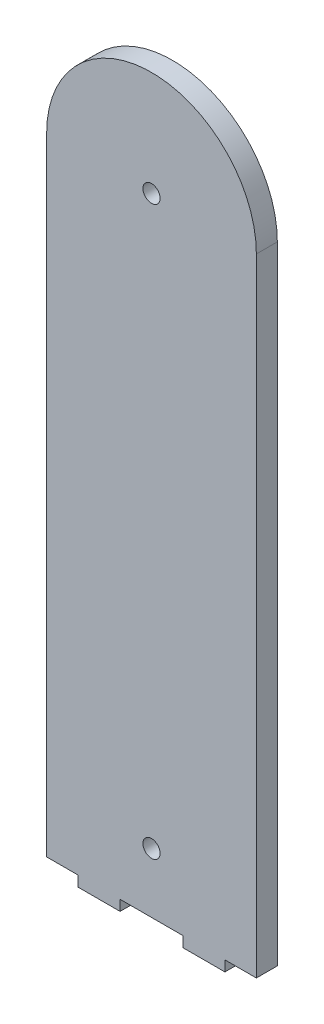
ISO-10303-21;
HEADER;
FILE_DESCRIPTION(('STEP AP214'),'2;1');
FILE_NAME('part.step','',(''),(''),'','','');
FILE_SCHEMA(('AUTOMOTIVE_DESIGN { 1 0 10303 214 1 1 1 1 }'));
ENDSEC;
DATA;
#1=APPLICATION_CONTEXT('core data for automotive mechanical design processes');
#2=APPLICATION_PROTOCOL_DEFINITION('international standard','automotive_design',2000,#1);
#3=PRODUCT_CONTEXT('',#1,'mechanical');
#4=PRODUCT('Part','Part','',(#3));
#5=PRODUCT_RELATED_PRODUCT_CATEGORY('part','',(#4));
#6=PRODUCT_DEFINITION_FORMATION('','',#4);
#7=PRODUCT_DEFINITION_CONTEXT('part definition',#1,'design');
#8=PRODUCT_DEFINITION('design','',#6,#7);
#9=PRODUCT_DEFINITION_SHAPE('','',#8);
#10=(LENGTH_UNIT() NAMED_UNIT(*) SI_UNIT(.MILLI.,.METRE.));
#11=(NAMED_UNIT(*) PLANE_ANGLE_UNIT() SI_UNIT($,.RADIAN.));
#12=(NAMED_UNIT(*) SI_UNIT($,.STERADIAN.) SOLID_ANGLE_UNIT());
#13=UNCERTAINTY_MEASURE_WITH_UNIT(LENGTH_MEASURE(1.E-05),#10,'distance_accuracy_value','');
#14=(GEOMETRIC_REPRESENTATION_CONTEXT(3) GLOBAL_UNCERTAINTY_ASSIGNED_CONTEXT((#13)) GLOBAL_UNIT_ASSIGNED_CONTEXT((#10,
#11,#12)) REPRESENTATION_CONTEXT('',''));
#15=CARTESIAN_POINT('',(0.,0.,0.));
#16=DIRECTION('',(0.,0.,1.));
#17=DIRECTION('',(1.,0.,0.));
#18=AXIS2_PLACEMENT_3D('',#15,#16,#17);
#19=CARTESIAN_POINT('',(-50.,0.,-10.));
#20=DIRECTION('',(-1.,0.,0.));
#21=DIRECTION('',(0.,-1.,0.));
#22=AXIS2_PLACEMENT_3D('',#19,#20,#21);
#23=PLANE('',#22);
#24=DIRECTION('',(0.,-1.,0.));
#25=VECTOR('',#24,1.);
#26=CARTESIAN_POINT('',(-50.,0.,0.));
#27=LINE('',#26,#25);
#28=CARTESIAN_POINT('',(-50.,299.,0.));
#29=VERTEX_POINT('',#28);
#30=CARTESIAN_POINT('',(-50.,0.,0.));
#31=VERTEX_POINT('',#30);
#32=EDGE_CURVE('E166',#29,#31,#27,.T.);
#33=ORIENTED_EDGE('',*,*,#32,.F.);
#34=DIRECTION('',(0.,0.,1.));
#35=VECTOR('',#34,1.);
#36=CARTESIAN_POINT('',(-50.,299.,-10.));
#37=LINE('',#36,#35);
#38=CARTESIAN_POINT('',(-50.,299.,-10.));
#39=VERTEX_POINT('',#38);
#40=EDGE_CURVE('E11',#39,#29,#37,.T.);
#41=ORIENTED_EDGE('',*,*,#40,.F.);
#42=DIRECTION('',(0.,-1.,0.));
#43=VECTOR('',#42,1.);
#44=CARTESIAN_POINT('',(-50.,0.,-10.));
#45=LINE('',#44,#43);
#46=CARTESIAN_POINT('',(-50.,0.,-10.));
#47=VERTEX_POINT('',#46);
#48=EDGE_CURVE('E211',#39,#47,#45,.T.);
#49=ORIENTED_EDGE('',*,*,#48,.T.);
#50=DIRECTION('',(0.,0.,1.));
#51=VECTOR('',#50,1.);
#52=CARTESIAN_POINT('',(-50.,0.,-10.));
#53=LINE('',#52,#51);
#54=EDGE_CURVE('E42',#47,#31,#53,.T.);
#55=ORIENTED_EDGE('',*,*,#54,.T.);
#56=EDGE_LOOP('',(#33,#41,#49,#55));
#57=FACE_BOUND('',#56,.T.);
#58=ADVANCED_FACE('F39',(#57),#23,.T.);
#59=CARTESIAN_POINT('',(0.,299.,-10.));
#60=DIRECTION('',(0.,0.,1.));
#61=DIRECTION('',(1.,0.,0.));
#62=AXIS2_PLACEMENT_3D('',#59,#60,#61);
#63=CYLINDRICAL_SURFACE('',#62,50.);
#64=CARTESIAN_POINT('',(0.,299.,0.));
#65=DIRECTION('',(0.,0.,1.));
#66=DIRECTION('',(-1.,0.,0.));
#67=AXIS2_PLACEMENT_3D('',#64,#65,#66);
#68=CIRCLE('',#67,50.);
#69=CARTESIAN_POINT('',(50.,299.,0.));
#70=VERTEX_POINT('',#69);
#71=EDGE_CURVE('E208',#70,#29,#68,.T.);
#72=ORIENTED_EDGE('',*,*,#71,.F.);
#73=DIRECTION('',(0.,0.,1.));
#74=VECTOR('',#73,1.);
#75=CARTESIAN_POINT('',(50.,299.,-10.));
#76=LINE('',#75,#74);
#77=CARTESIAN_POINT('',(50.,299.,-10.));
#78=VERTEX_POINT('',#77);
#79=EDGE_CURVE('E49',#78,#70,#76,.T.);
#80=ORIENTED_EDGE('',*,*,#79,.F.);
#81=CARTESIAN_POINT('',(0.,299.,-10.));
#82=DIRECTION('',(0.,0.,1.));
#83=DIRECTION('',(-1.,0.,0.));
#84=AXIS2_PLACEMENT_3D('',#81,#82,#83);
#85=CIRCLE('',#84,50.);
#86=EDGE_CURVE('E152',#78,#39,#85,.T.);
#87=ORIENTED_EDGE('',*,*,#86,.T.);
#88=ORIENTED_EDGE('',*,*,#40,.T.);
#89=EDGE_LOOP('',(#72,#80,#87,#88));
#90=FACE_BOUND('',#89,.T.);
#91=ADVANCED_FACE('F241',(#90),#63,.T.);
#92=CARTESIAN_POINT('',(50.,0.,-10.));
#93=DIRECTION('',(1.,0.,0.));
#94=DIRECTION('',(0.,1.,0.));
#95=AXIS2_PLACEMENT_3D('',#92,#93,#94);
#96=PLANE('',#95);
#97=DIRECTION('',(0.,1.,0.));
#98=VECTOR('',#97,1.);
#99=CARTESIAN_POINT('',(50.,0.,0.));
#100=LINE('',#99,#98);
#101=CARTESIAN_POINT('',(50.,0.,0.));
#102=VERTEX_POINT('',#101);
#103=EDGE_CURVE('E138',#102,#70,#100,.T.);
#104=ORIENTED_EDGE('',*,*,#103,.F.);
#105=DIRECTION('',(0.,0.,1.));
#106=VECTOR('',#105,1.);
#107=CARTESIAN_POINT('',(50.,0.,-10.));
#108=LINE('',#107,#106);
#109=CARTESIAN_POINT('',(50.,0.,-10.));
#110=VERTEX_POINT('',#109);
#111=EDGE_CURVE('E133',#110,#102,#108,.T.);
#112=ORIENTED_EDGE('',*,*,#111,.F.);
#113=DIRECTION('',(0.,1.,0.));
#114=VECTOR('',#113,1.);
#115=CARTESIAN_POINT('',(50.,0.,-10.));
#116=LINE('',#115,#114);
#117=EDGE_CURVE('E136',#110,#78,#116,.T.);
#118=ORIENTED_EDGE('',*,*,#117,.T.);
#119=ORIENTED_EDGE('',*,*,#79,.T.);
#120=EDGE_LOOP('',(#104,#112,#118,#119));
#121=FACE_BOUND('',#120,.T.);
#122=ADVANCED_FACE('F135',(#121),#96,.T.);
#123=CARTESIAN_POINT('',(35.,0.,-10.));
#124=DIRECTION('',(0.,-1.,0.));
#125=DIRECTION('',(0.,0.,-1.));
#126=AXIS2_PLACEMENT_3D('',#123,#124,#125);
#127=PLANE('',#126);
#128=DIRECTION('',(1.,0.,0.));
#129=VECTOR('',#128,1.);
#130=CARTESIAN_POINT('',(35.,0.,0.));
#131=LINE('',#130,#129);
#132=CARTESIAN_POINT('',(35.,0.,0.));
#133=VERTEX_POINT('',#132);
#134=EDGE_CURVE('E203',#133,#102,#131,.T.);
#135=ORIENTED_EDGE('',*,*,#134,.F.);
#136=DIRECTION('',(0.,0.,1.));
#137=VECTOR('',#136,1.);
#138=CARTESIAN_POINT('',(35.,0.,-10.));
#139=LINE('',#138,#137);
#140=CARTESIAN_POINT('',(35.,0.,-10.));
#141=VERTEX_POINT('',#140);
#142=EDGE_CURVE('E144',#141,#133,#139,.T.);
#143=ORIENTED_EDGE('',*,*,#142,.F.);
#144=DIRECTION('',(1.,0.,0.));
#145=VECTOR('',#144,1.);
#146=CARTESIAN_POINT('',(35.,0.,-10.));
#147=LINE('',#146,#145);
#148=EDGE_CURVE('E150',#141,#110,#147,.T.);
#149=ORIENTED_EDGE('',*,*,#148,.T.);
#150=ORIENTED_EDGE('',*,*,#111,.T.);
#151=EDGE_LOOP('',(#135,#143,#149,#150));
#152=FACE_BOUND('',#151,.T.);
#153=ADVANCED_FACE('F155',(#152),#127,.T.);
#154=CARTESIAN_POINT('',(35.,0.,-10.));
#155=DIRECTION('',(1.,0.,0.));
#156=DIRECTION('',(0.,1.,0.));
#157=AXIS2_PLACEMENT_3D('',#154,#155,#156);
#158=PLANE('',#157);
#159=DIRECTION('',(0.,1.,0.));
#160=VECTOR('',#159,1.);
#161=CARTESIAN_POINT('',(35.,0.,0.));
#162=LINE('',#161,#160);
#163=CARTESIAN_POINT('',(35.,-4.99999999999999,0.));
#164=VERTEX_POINT('',#163);
#165=EDGE_CURVE('E199',#164,#133,#162,.T.);
#166=ORIENTED_EDGE('',*,*,#165,.F.);
#167=DIRECTION('',(0.,0.,1.));
#168=VECTOR('',#167,1.);
#169=CARTESIAN_POINT('',(35.,-4.99999999999999,-10.));
#170=LINE('',#169,#168);
#171=CARTESIAN_POINT('',(35.,-4.99999999999999,-10.));
#172=VERTEX_POINT('',#171);
#173=EDGE_CURVE('E217',#172,#164,#170,.T.);
#174=ORIENTED_EDGE('',*,*,#173,.F.);
#175=DIRECTION('',(0.,1.,0.));
#176=VECTOR('',#175,1.);
#177=CARTESIAN_POINT('',(35.,0.,-10.));
#178=LINE('',#177,#176);
#179=EDGE_CURVE('E157',#172,#141,#178,.T.);
#180=ORIENTED_EDGE('',*,*,#179,.T.);
#181=ORIENTED_EDGE('',*,*,#142,.T.);
#182=EDGE_LOOP('',(#166,#174,#180,#181));
#183=FACE_BOUND('',#182,.T.);
#184=ADVANCED_FACE('F254',(#183),#158,.T.);
#185=CARTESIAN_POINT('',(35.,-4.99999999999999,-10.));
#186=DIRECTION('',(0.,-1.,0.));
#187=DIRECTION('',(1.,0.,0.));
#188=AXIS2_PLACEMENT_3D('',#185,#186,#187);
#189=PLANE('',#188);
#190=DIRECTION('',(1.,0.,0.));
#191=VECTOR('',#190,1.);
#192=CARTESIAN_POINT('',(35.,-4.99999999999999,0.));
#193=LINE('',#192,#191);
#194=CARTESIAN_POINT('',(15.,-4.99999999999999,0.));
#195=VERTEX_POINT('',#194);
#196=EDGE_CURVE('E195',#195,#164,#193,.T.);
#197=ORIENTED_EDGE('',*,*,#196,.F.);
#198=DIRECTION('',(0.,0.,1.));
#199=VECTOR('',#198,1.);
#200=CARTESIAN_POINT('',(15.,-4.99999999999999,-10.));
#201=LINE('',#200,#199);
#202=CARTESIAN_POINT('',(15.,-4.99999999999999,-10.));
#203=VERTEX_POINT('',#202);
#204=EDGE_CURVE('E220',#203,#195,#201,.T.);
#205=ORIENTED_EDGE('',*,*,#204,.F.);
#206=DIRECTION('',(1.,0.,0.));
#207=VECTOR('',#206,1.);
#208=CARTESIAN_POINT('',(35.,-4.99999999999999,-10.));
#209=LINE('',#208,#207);
#210=EDGE_CURVE('E160',#203,#172,#209,.T.);
#211=ORIENTED_EDGE('',*,*,#210,.T.);
#212=ORIENTED_EDGE('',*,*,#173,.T.);
#213=EDGE_LOOP('',(#197,#205,#211,#212));
#214=FACE_BOUND('',#213,.T.);
#215=ADVANCED_FACE('F257',(#214),#189,.T.);
#216=CARTESIAN_POINT('',(15.,0.,-10.));
#217=DIRECTION('',(-1.,0.,0.));
#218=DIRECTION('',(0.,-1.,0.));
#219=AXIS2_PLACEMENT_3D('',#216,#217,#218);
#220=PLANE('',#219);
#221=DIRECTION('',(0.,-1.,0.));
#222=VECTOR('',#221,1.);
#223=CARTESIAN_POINT('',(15.,0.,0.));
#224=LINE('',#223,#222);
#225=CARTESIAN_POINT('',(15.,0.,0.));
#226=VERTEX_POINT('',#225);
#227=EDGE_CURVE('E191',#226,#195,#224,.T.);
#228=ORIENTED_EDGE('',*,*,#227,.F.);
#229=DIRECTION('',(0.,0.,1.));
#230=VECTOR('',#229,1.);
#231=CARTESIAN_POINT('',(15.,0.,-10.));
#232=LINE('',#231,#230);
#233=CARTESIAN_POINT('',(15.,0.,-10.));
#234=VERTEX_POINT('',#233);
#235=EDGE_CURVE('E223',#234,#226,#232,.T.);
#236=ORIENTED_EDGE('',*,*,#235,.F.);
#237=DIRECTION('',(0.,-1.,0.));
#238=VECTOR('',#237,1.);
#239=CARTESIAN_POINT('',(15.,0.,-10.));
#240=LINE('',#239,#238);
#241=EDGE_CURVE('E341',#234,#203,#240,.T.);
#242=ORIENTED_EDGE('',*,*,#241,.T.);
#243=ORIENTED_EDGE('',*,*,#204,.T.);
#244=EDGE_LOOP('',(#228,#236,#242,#243));
#245=FACE_BOUND('',#244,.T.);
#246=ADVANCED_FACE('F261',(#245),#220,.T.);
#247=CARTESIAN_POINT('',(-15.,0.,-10.));
#248=DIRECTION('',(0.,-1.,0.));
#249=DIRECTION('',(0.,0.,-1.));
#250=AXIS2_PLACEMENT_3D('',#247,#248,#249);
#251=PLANE('',#250);
#252=DIRECTION('',(1.,0.,0.));
#253=VECTOR('',#252,1.);
#254=CARTESIAN_POINT('',(-15.,0.,0.));
#255=LINE('',#254,#253);
#256=CARTESIAN_POINT('',(-15.,0.,0.));
#257=VERTEX_POINT('',#256);
#258=EDGE_CURVE('E187',#257,#226,#255,.T.);
#259=ORIENTED_EDGE('',*,*,#258,.F.);
#260=DIRECTION('',(0.,0.,1.));
#261=VECTOR('',#260,1.);
#262=CARTESIAN_POINT('',(-15.,0.,-10.));
#263=LINE('',#262,#261);
#264=CARTESIAN_POINT('',(-15.,0.,-10.));
#265=VERTEX_POINT('',#264);
#266=EDGE_CURVE('E226',#265,#257,#263,.T.);
#267=ORIENTED_EDGE('',*,*,#266,.F.);
#268=DIRECTION('',(1.,0.,0.));
#269=VECTOR('',#268,1.);
#270=CARTESIAN_POINT('',(-15.,0.,-10.));
#271=LINE('',#270,#269);
#272=EDGE_CURVE('E337',#265,#234,#271,.T.);
#273=ORIENTED_EDGE('',*,*,#272,.T.);
#274=ORIENTED_EDGE('',*,*,#235,.T.);
#275=EDGE_LOOP('',(#259,#267,#273,#274));
#276=FACE_BOUND('',#275,.T.);
#277=ADVANCED_FACE('F265',(#276),#251,.T.);
#278=CARTESIAN_POINT('',(-15.,0.,-10.));
#279=DIRECTION('',(1.,0.,0.));
#280=DIRECTION('',(0.,1.,0.));
#281=AXIS2_PLACEMENT_3D('',#278,#279,#280);
#282=PLANE('',#281);
#283=DIRECTION('',(0.,1.,0.));
#284=VECTOR('',#283,1.);
#285=CARTESIAN_POINT('',(-15.,0.,0.));
#286=LINE('',#285,#284);
#287=CARTESIAN_POINT('',(-15.,-5.,0.));
#288=VERTEX_POINT('',#287);
#289=EDGE_CURVE('E183',#288,#257,#286,.T.);
#290=ORIENTED_EDGE('',*,*,#289,.F.);
#291=DIRECTION('',(0.,0.,1.));
#292=VECTOR('',#291,1.);
#293=CARTESIAN_POINT('',(-15.,-5.,-10.));
#294=LINE('',#293,#292);
#295=CARTESIAN_POINT('',(-15.,-5.,-10.));
#296=VERTEX_POINT('',#295);
#297=EDGE_CURVE('E229',#296,#288,#294,.T.);
#298=ORIENTED_EDGE('',*,*,#297,.F.);
#299=DIRECTION('',(0.,1.,0.));
#300=VECTOR('',#299,1.);
#301=CARTESIAN_POINT('',(-15.,0.,-10.));
#302=LINE('',#301,#300);
#303=EDGE_CURVE('E333',#296,#265,#302,.T.);
#304=ORIENTED_EDGE('',*,*,#303,.T.);
#305=ORIENTED_EDGE('',*,*,#266,.T.);
#306=EDGE_LOOP('',(#290,#298,#304,#305));
#307=FACE_BOUND('',#306,.T.);
#308=ADVANCED_FACE('F269',(#307),#282,.T.);
#309=CARTESIAN_POINT('',(-35.,-5.,-10.));
#310=DIRECTION('',(0.,-1.,0.));
#311=DIRECTION('',(0.,0.,-1.));
#312=AXIS2_PLACEMENT_3D('',#309,#310,#311);
#313=PLANE('',#312);
#314=DIRECTION('',(1.,0.,0.));
#315=VECTOR('',#314,1.);
#316=CARTESIAN_POINT('',(-35.,-5.,0.));
#317=LINE('',#316,#315);
#318=CARTESIAN_POINT('',(-35.,-5.,0.));
#319=VERTEX_POINT('',#318);
#320=EDGE_CURVE('E179',#319,#288,#317,.T.);
#321=ORIENTED_EDGE('',*,*,#320,.F.);
#322=DIRECTION('',(0.,0.,1.));
#323=VECTOR('',#322,1.);
#324=CARTESIAN_POINT('',(-35.,-5.,-10.));
#325=LINE('',#324,#323);
#326=CARTESIAN_POINT('',(-35.,-5.,-10.));
#327=VERTEX_POINT('',#326);
#328=EDGE_CURVE('E232',#327,#319,#325,.T.);
#329=ORIENTED_EDGE('',*,*,#328,.F.);
#330=DIRECTION('',(1.,0.,0.));
#331=VECTOR('',#330,1.);
#332=CARTESIAN_POINT('',(-35.,-5.,-10.));
#333=LINE('',#332,#331);
#334=EDGE_CURVE('E329',#327,#296,#333,.T.);
#335=ORIENTED_EDGE('',*,*,#334,.T.);
#336=ORIENTED_EDGE('',*,*,#297,.T.);
#337=EDGE_LOOP('',(#321,#329,#335,#336));
#338=FACE_BOUND('',#337,.T.);
#339=ADVANCED_FACE('F273',(#338),#313,.T.);
#340=CARTESIAN_POINT('',(-35.,0.,-10.));
#341=DIRECTION('',(-1.,0.,0.));
#342=DIRECTION('',(0.,-1.,0.));
#343=AXIS2_PLACEMENT_3D('',#340,#341,#342);
#344=PLANE('',#343);
#345=DIRECTION('',(0.,-1.,0.));
#346=VECTOR('',#345,1.);
#347=CARTESIAN_POINT('',(-35.,0.,0.));
#348=LINE('',#347,#346);
#349=CARTESIAN_POINT('',(-35.,0.,0.));
#350=VERTEX_POINT('',#349);
#351=EDGE_CURVE('E175',#350,#319,#348,.T.);
#352=ORIENTED_EDGE('',*,*,#351,.F.);
#353=DIRECTION('',(0.,0.,1.));
#354=VECTOR('',#353,1.);
#355=CARTESIAN_POINT('',(-35.,0.,-10.));
#356=LINE('',#355,#354);
#357=CARTESIAN_POINT('',(-35.,0.,-10.));
#358=VERTEX_POINT('',#357);
#359=EDGE_CURVE('E234',#358,#350,#356,.T.);
#360=ORIENTED_EDGE('',*,*,#359,.F.);
#361=DIRECTION('',(0.,-1.,0.));
#362=VECTOR('',#361,1.);
#363=CARTESIAN_POINT('',(-35.,0.,-10.));
#364=LINE('',#363,#362);
#365=EDGE_CURVE('E325',#358,#327,#364,.T.);
#366=ORIENTED_EDGE('',*,*,#365,.T.);
#367=ORIENTED_EDGE('',*,*,#328,.T.);
#368=EDGE_LOOP('',(#352,#360,#366,#367));
#369=FACE_BOUND('',#368,.T.);
#370=ADVANCED_FACE('F277',(#369),#344,.T.);
#371=CARTESIAN_POINT('',(-50.,0.,-10.));
#372=DIRECTION('',(0.,-1.,0.));
#373=DIRECTION('',(0.,0.,-1.));
#374=AXIS2_PLACEMENT_3D('',#371,#372,#373);
#375=PLANE('',#374);
#376=DIRECTION('',(1.,0.,0.));
#377=VECTOR('',#376,1.);
#378=CARTESIAN_POINT('',(-50.,0.,0.));
#379=LINE('',#378,#377);
#380=EDGE_CURVE('E170',#31,#350,#379,.T.);
#381=ORIENTED_EDGE('',*,*,#380,.F.);
#382=ORIENTED_EDGE('',*,*,#54,.F.);
#383=DIRECTION('',(1.,0.,0.));
#384=VECTOR('',#383,1.);
#385=CARTESIAN_POINT('',(-50.,0.,-10.));
#386=LINE('',#385,#384);
#387=EDGE_CURVE('E322',#47,#358,#386,.T.);
#388=ORIENTED_EDGE('',*,*,#387,.T.);
#389=ORIENTED_EDGE('',*,*,#359,.T.);
#390=EDGE_LOOP('',(#381,#382,#388,#389));
#391=FACE_BOUND('',#390,.T.);
#392=ADVANCED_FACE('F238',(#391),#375,.T.);
#393=CARTESIAN_POINT('',(0.,299.,-10.));
#394=DIRECTION('',(0.,0.,-1.));
#395=DIRECTION('',(-1.,0.,0.));
#396=AXIS2_PLACEMENT_3D('',#393,#394,#395);
#397=PLANE('',#396);
#398=CARTESIAN_POINT('',(0.,28.5,-10.));
#399=DIRECTION('',(0.,0.,1.));
#400=DIRECTION('',(1.,0.,0.));
#401=AXIS2_PLACEMENT_3D('',#398,#399,#400);
#402=CIRCLE('',#401,4.1);
#403=CARTESIAN_POINT('',(4.10000000000003,28.5,-10.));
#404=VERTEX_POINT('',#403);
#405=EDGE_CURVE('E304',#404,#404,#402,.T.);
#406=ORIENTED_EDGE('',*,*,#405,.T.);
#407=EDGE_LOOP('',(#406));
#408=FACE_BOUND('',#407,.T.);
#409=CARTESIAN_POINT('',(0.,299.,-10.));
#410=DIRECTION('',(0.,0.,1.));
#411=DIRECTION('',(1.,0.,0.));
#412=AXIS2_PLACEMENT_3D('',#409,#410,#411);
#413=CIRCLE('',#412,4.1);
#414=CARTESIAN_POINT('',(4.1,299.,-10.));
#415=VERTEX_POINT('',#414);
#416=EDGE_CURVE('E171',#415,#415,#413,.T.);
#417=ORIENTED_EDGE('',*,*,#416,.T.);
#418=EDGE_LOOP('',(#417));
#419=FACE_BOUND('',#418,.T.);
#420=ORIENTED_EDGE('',*,*,#48,.F.);
#421=ORIENTED_EDGE('',*,*,#86,.F.);
#422=ORIENTED_EDGE('',*,*,#117,.F.);
#423=ORIENTED_EDGE('',*,*,#148,.F.);
#424=ORIENTED_EDGE('',*,*,#179,.F.);
#425=ORIENTED_EDGE('',*,*,#210,.F.);
#426=ORIENTED_EDGE('',*,*,#241,.F.);
#427=ORIENTED_EDGE('',*,*,#272,.F.);
#428=ORIENTED_EDGE('',*,*,#303,.F.);
#429=ORIENTED_EDGE('',*,*,#334,.F.);
#430=ORIENTED_EDGE('',*,*,#365,.F.);
#431=ORIENTED_EDGE('',*,*,#387,.F.);
#432=EDGE_LOOP('',(#420,#421,#422,#423,#424,#425,#426,#427,#428,#429,#430,#431));
#433=FACE_BOUND('',#432,.T.);
#434=ADVANCED_FACE('F148',(#408,#419,#433),#397,.T.);
#435=CARTESIAN_POINT('',(0.,299.,0.));
#436=DIRECTION('',(0.,0.,-1.));
#437=DIRECTION('',(-1.,0.,0.));
#438=AXIS2_PLACEMENT_3D('',#435,#436,#437);
#439=PLANE('',#438);
#440=CARTESIAN_POINT('',(0.,28.5,0.));
#441=DIRECTION('',(0.,0.,1.));
#442=DIRECTION('',(1.,0.,0.));
#443=AXIS2_PLACEMENT_3D('',#440,#441,#442);
#444=CIRCLE('',#443,4.1);
#445=CARTESIAN_POINT('',(4.10000000000003,28.5,0.));
#446=VERTEX_POINT('',#445);
#447=EDGE_CURVE('E307',#446,#446,#444,.T.);
#448=ORIENTED_EDGE('',*,*,#447,.F.);
#449=EDGE_LOOP('',(#448));
#450=FACE_BOUND('',#449,.T.);
#451=CARTESIAN_POINT('',(0.,299.,0.));
#452=DIRECTION('',(0.,0.,1.));
#453=DIRECTION('',(1.,0.,0.));
#454=AXIS2_PLACEMENT_3D('',#451,#452,#453);
#455=CIRCLE('',#454,4.1);
#456=CARTESIAN_POINT('',(4.1,299.,0.));
#457=VERTEX_POINT('',#456);
#458=EDGE_CURVE('E311',#457,#457,#455,.T.);
#459=ORIENTED_EDGE('',*,*,#458,.F.);
#460=EDGE_LOOP('',(#459));
#461=FACE_BOUND('',#460,.T.);
#462=ORIENTED_EDGE('',*,*,#32,.T.);
#463=ORIENTED_EDGE('',*,*,#380,.T.);
#464=ORIENTED_EDGE('',*,*,#351,.T.);
#465=ORIENTED_EDGE('',*,*,#320,.T.);
#466=ORIENTED_EDGE('',*,*,#289,.T.);
#467=ORIENTED_EDGE('',*,*,#258,.T.);
#468=ORIENTED_EDGE('',*,*,#227,.T.);
#469=ORIENTED_EDGE('',*,*,#196,.T.);
#470=ORIENTED_EDGE('',*,*,#165,.T.);
#471=ORIENTED_EDGE('',*,*,#134,.T.);
#472=ORIENTED_EDGE('',*,*,#103,.T.);
#473=ORIENTED_EDGE('',*,*,#71,.T.);
#474=EDGE_LOOP('',(#462,#463,#464,#465,#466,#467,#468,#469,#470,#471,#472,#473));
#475=FACE_BOUND('',#474,.T.);
#476=ADVANCED_FACE('F240',(#450,#461,#475),#439,.F.);
#477=CARTESIAN_POINT('',(0.,299.,-10.));
#478=DIRECTION('',(0.,0.,1.));
#479=DIRECTION('',(1.,0.,0.));
#480=AXIS2_PLACEMENT_3D('',#477,#478,#479);
#481=CYLINDRICAL_SURFACE('',#480,4.1);
#482=ORIENTED_EDGE('',*,*,#416,.F.);
#483=EDGE_LOOP('',(#482));
#484=FACE_BOUND('',#483,.T.);
#485=ORIENTED_EDGE('',*,*,#458,.T.);
#486=EDGE_LOOP('',(#485));
#487=FACE_BOUND('',#486,.T.);
#488=ADVANCED_FACE('F289',(#484,#487),#481,.F.);
#489=CARTESIAN_POINT('',(0.,28.5,-10.));
#490=DIRECTION('',(0.,0.,1.));
#491=DIRECTION('',(1.,0.,0.));
#492=AXIS2_PLACEMENT_3D('',#489,#490,#491);
#493=CYLINDRICAL_SURFACE('',#492,4.1);
#494=ORIENTED_EDGE('',*,*,#405,.F.);
#495=EDGE_LOOP('',(#494));
#496=FACE_BOUND('',#495,.T.);
#497=ORIENTED_EDGE('',*,*,#447,.T.);
#498=EDGE_LOOP('',(#497));
#499=FACE_BOUND('',#498,.T.);
#500=ADVANCED_FACE('F296',(#496,#499),#493,.F.);
#501=CLOSED_SHELL('',(#58,#91,#122,#153,#184,#215,#246,#277,#308,#339,#370,#392,#434,#476,#488,#500));
#502=MANIFOLD_SOLID_BREP('B2',#501);
#503=ADVANCED_BREP_SHAPE_REPRESENTATION('',(#18,#502),#14);
#504=SHAPE_DEFINITION_REPRESENTATION(#9,#503);
ENDSEC;
END-ISO-10303-21;
